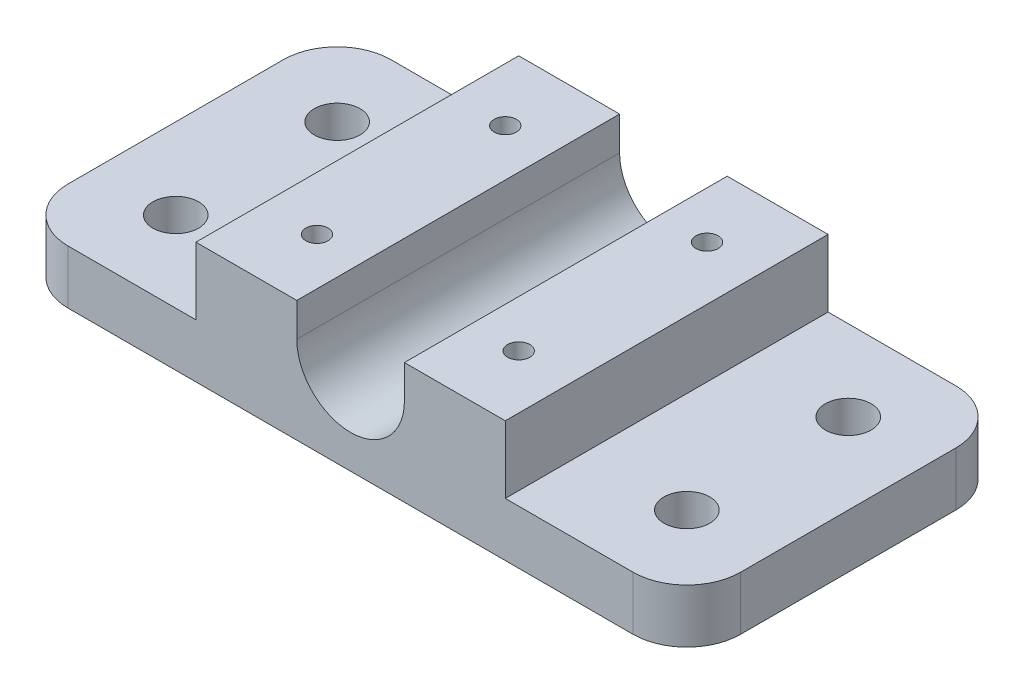
ISO-10303-21;
HEADER;
FILE_DESCRIPTION(('STEP AP214'),'2;1');
FILE_NAME('part.step','',(''),(''),'','','');
FILE_SCHEMA(('AUTOMOTIVE_DESIGN { 1 0 10303 214 1 1 1 1 }'));
ENDSEC;
DATA;
#1=APPLICATION_CONTEXT('core data for automotive mechanical design processes');
#2=APPLICATION_PROTOCOL_DEFINITION('international standard','automotive_design',2000,#1);
#3=PRODUCT_CONTEXT('',#1,'mechanical');
#4=PRODUCT('Part','Part','',(#3));
#5=PRODUCT_RELATED_PRODUCT_CATEGORY('part','',(#4));
#6=PRODUCT_DEFINITION_FORMATION('','',#4);
#7=PRODUCT_DEFINITION_CONTEXT('part definition',#1,'design');
#8=PRODUCT_DEFINITION('design','',#6,#7);
#9=PRODUCT_DEFINITION_SHAPE('','',#8);
#10=(LENGTH_UNIT() NAMED_UNIT(*) SI_UNIT(.MILLI.,.METRE.));
#11=(NAMED_UNIT(*) PLANE_ANGLE_UNIT() SI_UNIT($,.RADIAN.));
#12=(NAMED_UNIT(*) SI_UNIT($,.STERADIAN.) SOLID_ANGLE_UNIT());
#13=UNCERTAINTY_MEASURE_WITH_UNIT(LENGTH_MEASURE(1.E-05),#10,'distance_accuracy_value','');
#14=(GEOMETRIC_REPRESENTATION_CONTEXT(3) GLOBAL_UNCERTAINTY_ASSIGNED_CONTEXT((#13)) GLOBAL_UNIT_ASSIGNED_CONTEXT((#10,
#11,#12)) REPRESENTATION_CONTEXT('',''));
#15=CARTESIAN_POINT('',(0.,0.,0.));
#16=DIRECTION('',(0.,0.,1.));
#17=DIRECTION('',(1.,0.,0.));
#18=AXIS2_PLACEMENT_3D('',#15,#16,#17);
#19=CARTESIAN_POINT('',(0.,18.,0.));
#20=DIRECTION('',(0.,1.,0.));
#21=DIRECTION('',(0.,0.,1.));
#22=AXIS2_PLACEMENT_3D('',#19,#20,#21);
#23=PLANE('',#22);
#24=CARTESIAN_POINT('',(-15.,18.,-14.));
#25=DIRECTION('',(0.,1.,0.));
#26=DIRECTION('',(0.,0.,1.));
#27=AXIS2_PLACEMENT_3D('',#24,#25,#26);
#28=CIRCLE('',#27,1.64999999999999);
#29=CARTESIAN_POINT('',(-15.,18.,-12.35));
#30=VERTEX_POINT('',#29);
#31=EDGE_CURVE('E171',#30,#30,#28,.T.);
#32=ORIENTED_EDGE('',*,*,#31,.F.);
#33=EDGE_LOOP('',(#32));
#34=FACE_BOUND('',#33,.T.);
#35=CARTESIAN_POINT('',(-15.,18.,14.));
#36=DIRECTION('',(0.,1.,0.));
#37=DIRECTION('',(0.,0.,1.));
#38=AXIS2_PLACEMENT_3D('',#35,#36,#37);
#39=CIRCLE('',#38,1.64999999999999);
#40=CARTESIAN_POINT('',(-15.,18.,15.65));
#41=VERTEX_POINT('',#40);
#42=EDGE_CURVE('E170',#41,#41,#39,.T.);
#43=ORIENTED_EDGE('',*,*,#42,.F.);
#44=EDGE_LOOP('',(#43));
#45=FACE_BOUND('',#44,.T.);
#46=DIRECTION('',(0.,0.,1.));
#47=VECTOR('',#46,1.);
#48=CARTESIAN_POINT('',(-8.,18.,-24.));
#49=LINE('',#48,#47);
#50=CARTESIAN_POINT('',(-8.,18.,-24.));
#51=VERTEX_POINT('',#50);
#52=CARTESIAN_POINT('',(-8.,18.,24.));
#53=VERTEX_POINT('',#52);
#54=EDGE_CURVE('E216',#51,#53,#49,.T.);
#55=ORIENTED_EDGE('',*,*,#54,.F.);
#56=DIRECTION('',(-1.,0.,0.));
#57=VECTOR('',#56,1.);
#58=CARTESIAN_POINT('',(-23.,18.,-24.));
#59=LINE('',#58,#57);
#60=CARTESIAN_POINT('',(-23.,18.,-24.));
#61=VERTEX_POINT('',#60);
#62=EDGE_CURVE('E225',#51,#61,#59,.T.);
#63=ORIENTED_EDGE('',*,*,#62,.T.);
#64=DIRECTION('',(0.,0.,1.));
#65=VECTOR('',#64,1.);
#66=CARTESIAN_POINT('',(-23.,18.,-24.));
#67=LINE('',#66,#65);
#68=CARTESIAN_POINT('',(-23.,18.,24.));
#69=VERTEX_POINT('',#68);
#70=EDGE_CURVE('E230',#61,#69,#67,.T.);
#71=ORIENTED_EDGE('',*,*,#70,.T.);
#72=DIRECTION('',(1.,0.,0.));
#73=VECTOR('',#72,1.);
#74=CARTESIAN_POINT('',(-23.,18.,24.));
#75=LINE('',#74,#73);
#76=EDGE_CURVE('E233',#69,#53,#75,.T.);
#77=ORIENTED_EDGE('',*,*,#76,.T.);
#78=EDGE_LOOP('',(#55,#63,#71,#77));
#79=FACE_BOUND('',#78,.T.);
#80=ADVANCED_FACE('F37',(#34,#45,#79),#23,.T.);
#81=CARTESIAN_POINT('',(0.,8.,0.));
#82=DIRECTION('',(0.,1.,0.));
#83=DIRECTION('',(0.,0.,1.));
#84=AXIS2_PLACEMENT_3D('',#81,#82,#83);
#85=PLANE('',#84);
#86=CARTESIAN_POINT('',(38.,8.,12.));
#87=DIRECTION('',(0.,1.,0.));
#88=DIRECTION('',(0.,0.,1.));
#89=AXIS2_PLACEMENT_3D('',#86,#87,#88);
#90=CIRCLE('',#89,3.39999999999999);
#91=CARTESIAN_POINT('',(38.,8.,15.4));
#92=VERTEX_POINT('',#91);
#93=EDGE_CURVE('E455',#92,#92,#90,.T.);
#94=ORIENTED_EDGE('',*,*,#93,.F.);
#95=EDGE_LOOP('',(#94));
#96=FACE_BOUND('',#95,.T.);
#97=CARTESIAN_POINT('',(38.,8.,-12.));
#98=DIRECTION('',(0.,1.,0.));
#99=DIRECTION('',(0.,0.,1.));
#100=AXIS2_PLACEMENT_3D('',#97,#98,#99);
#101=CIRCLE('',#100,3.39999999999999);
#102=CARTESIAN_POINT('',(38.,8.,-8.60000000000001));
#103=VERTEX_POINT('',#102);
#104=EDGE_CURVE('E461',#103,#103,#101,.T.);
#105=ORIENTED_EDGE('',*,*,#104,.F.);
#106=EDGE_LOOP('',(#105));
#107=FACE_BOUND('',#106,.T.);
#108=DIRECTION('',(0.,0.,-1.));
#109=VECTOR('',#108,1.);
#110=CARTESIAN_POINT('',(50.,8.,-24.));
#111=LINE('',#110,#109);
#112=CARTESIAN_POINT('',(50.,8.,16.));
#113=VERTEX_POINT('',#112);
#114=CARTESIAN_POINT('',(50.,8.,-16.));
#115=VERTEX_POINT('',#114);
#116=EDGE_CURVE('E253',#113,#115,#111,.T.);
#117=ORIENTED_EDGE('',*,*,#116,.T.);
#118=CARTESIAN_POINT('',(42.,8.,-16.));
#119=DIRECTION('',(0.,1.,0.));
#120=DIRECTION('',(0.,0.,1.));
#121=AXIS2_PLACEMENT_3D('',#118,#119,#120);
#122=CIRCLE('',#121,8.);
#123=CARTESIAN_POINT('',(42.,8.,-24.));
#124=VERTEX_POINT('',#123);
#125=EDGE_CURVE('E294',#115,#124,#122,.T.);
#126=ORIENTED_EDGE('',*,*,#125,.T.);
#127=DIRECTION('',(-1.,0.,0.));
#128=VECTOR('',#127,1.);
#129=CARTESIAN_POINT('',(-50.,8.,-24.));
#130=LINE('',#129,#128);
#131=CARTESIAN_POINT('',(23.,8.,-24.));
#132=VERTEX_POINT('',#131);
#133=EDGE_CURVE('E258',#124,#132,#130,.T.);
#134=ORIENTED_EDGE('',*,*,#133,.T.);
#135=DIRECTION('',(0.,0.,-1.));
#136=VECTOR('',#135,1.);
#137=CARTESIAN_POINT('',(23.,8.,-24.));
#138=LINE('',#137,#136);
#139=CARTESIAN_POINT('',(23.,8.,24.));
#140=VERTEX_POINT('',#139);
#141=EDGE_CURVE('E215',#140,#132,#138,.T.);
#142=ORIENTED_EDGE('',*,*,#141,.F.);
#143=DIRECTION('',(1.,0.,0.));
#144=VECTOR('',#143,1.);
#145=CARTESIAN_POINT('',(-50.,8.,24.));
#146=LINE('',#145,#144);
#147=CARTESIAN_POINT('',(42.,8.,24.));
#148=VERTEX_POINT('',#147);
#149=EDGE_CURVE('E262',#140,#148,#146,.T.);
#150=ORIENTED_EDGE('',*,*,#149,.T.);
#151=CARTESIAN_POINT('',(42.,8.,16.));
#152=DIRECTION('',(0.,1.,0.));
#153=DIRECTION('',(0.,0.,1.));
#154=AXIS2_PLACEMENT_3D('',#151,#152,#153);
#155=CIRCLE('',#154,8.);
#156=EDGE_CURVE('E292',#148,#113,#155,.T.);
#157=ORIENTED_EDGE('',*,*,#156,.T.);
#158=EDGE_LOOP('',(#117,#126,#134,#142,#150,#157));
#159=FACE_BOUND('',#158,.T.);
#160=ADVANCED_FACE('F345',(#96,#107,#159),#85,.T.);
#161=CARTESIAN_POINT('',(50.,8.,-24.));
#162=DIRECTION('',(-1.,0.,0.));
#163=DIRECTION('',(0.,0.,1.));
#164=AXIS2_PLACEMENT_3D('',#161,#162,#163);
#165=PLANE('',#164);
#166=DIRECTION('',(0.,0.,-1.));
#167=VECTOR('',#166,1.);
#168=CARTESIAN_POINT('',(50.,0.,-24.));
#169=LINE('',#168,#167);
#170=CARTESIAN_POINT('',(50.,0.,16.));
#171=VERTEX_POINT('',#170);
#172=CARTESIAN_POINT('',(50.,0.,-16.));
#173=VERTEX_POINT('',#172);
#174=EDGE_CURVE('E252',#171,#173,#169,.T.);
#175=ORIENTED_EDGE('',*,*,#174,.T.);
#176=DIRECTION('',(0.,-1.,0.));
#177=VECTOR('',#176,1.);
#178=CARTESIAN_POINT('',(50.,8.,-16.));
#179=LINE('',#178,#177);
#180=EDGE_CURVE('E290',#173,#115,#179,.F.);
#181=ORIENTED_EDGE('',*,*,#180,.T.);
#182=ORIENTED_EDGE('',*,*,#116,.F.);
#183=DIRECTION('',(0.,-1.,0.));
#184=VECTOR('',#183,1.);
#185=CARTESIAN_POINT('',(50.,8.,16.));
#186=LINE('',#185,#184);
#187=EDGE_CURVE('E287',#113,#171,#186,.T.);
#188=ORIENTED_EDGE('',*,*,#187,.T.);
#189=EDGE_LOOP('',(#175,#181,#182,#188));
#190=FACE_BOUND('',#189,.T.);
#191=ADVANCED_FACE('F334',(#190),#165,.F.);
#192=CARTESIAN_POINT('',(-50.,8.,-24.));
#193=DIRECTION('',(0.,0.,1.));
#194=DIRECTION('',(1.,0.,0.));
#195=AXIS2_PLACEMENT_3D('',#192,#193,#194);
#196=PLANE('',#195);
#197=ORIENTED_EDGE('',*,*,#133,.F.);
#198=DIRECTION('',(0.,-1.,0.));
#199=VECTOR('',#198,1.);
#200=CARTESIAN_POINT('',(42.,8.,-24.));
#201=LINE('',#200,#199);
#202=CARTESIAN_POINT('',(42.,0.,-24.));
#203=VERTEX_POINT('',#202);
#204=EDGE_CURVE('E276',#124,#203,#201,.T.);
#205=ORIENTED_EDGE('',*,*,#204,.T.);
#206=DIRECTION('',(-1.,0.,0.));
#207=VECTOR('',#206,1.);
#208=CARTESIAN_POINT('',(-50.,0.,-24.));
#209=LINE('',#208,#207);
#210=CARTESIAN_POINT('',(-42.,0.,-24.));
#211=VERTEX_POINT('',#210);
#212=EDGE_CURVE('E268',#203,#211,#209,.T.);
#213=ORIENTED_EDGE('',*,*,#212,.T.);
#214=DIRECTION('',(0.,-1.,0.));
#215=VECTOR('',#214,1.);
#216=CARTESIAN_POINT('',(-42.,8.,-24.));
#217=LINE('',#216,#215);
#218=CARTESIAN_POINT('',(-42.,8.,-24.));
#219=VERTEX_POINT('',#218);
#220=EDGE_CURVE('E265',#211,#219,#217,.F.);
#221=ORIENTED_EDGE('',*,*,#220,.T.);
#222=CARTESIAN_POINT('',(-23.,8.,-24.));
#223=VERTEX_POINT('',#222);
#224=EDGE_CURVE('E256',#223,#219,#130,.T.);
#225=ORIENTED_EDGE('',*,*,#224,.F.);
#226=DIRECTION('',(0.,-1.,0.));
#227=VECTOR('',#226,1.);
#228=CARTESIAN_POINT('',(-23.,18.,-24.));
#229=LINE('',#228,#227);
#230=EDGE_CURVE('E246',#61,#223,#229,.T.);
#231=ORIENTED_EDGE('',*,*,#230,.F.);
#232=ORIENTED_EDGE('',*,*,#62,.F.);
#233=DIRECTION('',(0.,-1.,0.));
#234=VECTOR('',#233,1.);
#235=CARTESIAN_POINT('',(-8.,13.,-24.));
#236=LINE('',#235,#234);
#237=CARTESIAN_POINT('',(-8.,13.,-24.));
#238=VERTEX_POINT('',#237);
#239=EDGE_CURVE('E203',#51,#238,#236,.T.);
#240=ORIENTED_EDGE('',*,*,#239,.T.);
#241=CARTESIAN_POINT('',(0.,13.,-24.));
#242=DIRECTION('',(0.,0.,1.));
#243=DIRECTION('',(1.,0.,0.));
#244=AXIS2_PLACEMENT_3D('',#241,#242,#243);
#245=CIRCLE('',#244,8.);
#246=CARTESIAN_POINT('',(8.,13.,-24.));
#247=VERTEX_POINT('',#246);
#248=EDGE_CURVE('E196',#238,#247,#245,.T.);
#249=ORIENTED_EDGE('',*,*,#248,.T.);
#250=DIRECTION('',(0.,1.,0.));
#251=VECTOR('',#250,1.);
#252=CARTESIAN_POINT('',(8.,13.,-24.));
#253=LINE('',#252,#251);
#254=CARTESIAN_POINT('',(8.,18.,-24.));
#255=VERTEX_POINT('',#254);
#256=EDGE_CURVE('E199',#247,#255,#253,.T.);
#257=ORIENTED_EDGE('',*,*,#256,.T.);
#258=CARTESIAN_POINT('',(23.,18.,-24.));
#259=VERTEX_POINT('',#258);
#260=EDGE_CURVE('E227',#259,#255,#59,.T.);
#261=ORIENTED_EDGE('',*,*,#260,.F.);
#262=DIRECTION('',(0.,-1.,0.));
#263=VECTOR('',#262,1.);
#264=CARTESIAN_POINT('',(23.,18.,-24.));
#265=LINE('',#264,#263);
#266=EDGE_CURVE('E249',#259,#132,#265,.T.);
#267=ORIENTED_EDGE('',*,*,#266,.T.);
#268=EDGE_LOOP('',(#197,#205,#213,#221,#225,#231,#232,#240,#249,#257,#261,#267));
#269=FACE_BOUND('',#268,.T.);
#270=ADVANCED_FACE('F325',(#269),#196,.F.);
#271=CARTESIAN_POINT('',(-50.,8.,-24.));
#272=DIRECTION('',(1.,0.,0.));
#273=DIRECTION('',(0.,0.,-1.));
#274=AXIS2_PLACEMENT_3D('',#271,#272,#273);
#275=PLANE('',#274);
#276=DIRECTION('',(0.,0.,1.));
#277=VECTOR('',#276,1.);
#278=CARTESIAN_POINT('',(-50.,8.,-24.));
#279=LINE('',#278,#277);
#280=CARTESIAN_POINT('',(-50.,8.,-16.));
#281=VERTEX_POINT('',#280);
#282=CARTESIAN_POINT('',(-50.,8.,16.));
#283=VERTEX_POINT('',#282);
#284=EDGE_CURVE('E260',#281,#283,#279,.T.);
#285=ORIENTED_EDGE('',*,*,#284,.F.);
#286=DIRECTION('',(0.,-1.,0.));
#287=VECTOR('',#286,1.);
#288=CARTESIAN_POINT('',(-50.,8.,-16.));
#289=LINE('',#288,#287);
#290=CARTESIAN_POINT('',(-50.,0.,-16.));
#291=VERTEX_POINT('',#290);
#292=EDGE_CURVE('E302',#281,#291,#289,.T.);
#293=ORIENTED_EDGE('',*,*,#292,.T.);
#294=DIRECTION('',(0.,0.,1.));
#295=VECTOR('',#294,1.);
#296=CARTESIAN_POINT('',(-50.,0.,-24.));
#297=LINE('',#296,#295);
#298=CARTESIAN_POINT('',(-50.,0.,16.));
#299=VERTEX_POINT('',#298);
#300=EDGE_CURVE('E271',#291,#299,#297,.T.);
#301=ORIENTED_EDGE('',*,*,#300,.T.);
#302=DIRECTION('',(0.,-1.,0.));
#303=VECTOR('',#302,1.);
#304=CARTESIAN_POINT('',(-50.,8.,16.));
#305=LINE('',#304,#303);
#306=EDGE_CURVE('E52',#299,#283,#305,.F.);
#307=ORIENTED_EDGE('',*,*,#306,.T.);
#308=EDGE_LOOP('',(#285,#293,#301,#307));
#309=FACE_BOUND('',#308,.T.);
#310=ADVANCED_FACE('F318',(#309),#275,.F.);
#311=CARTESIAN_POINT('',(-50.,8.,24.));
#312=DIRECTION('',(0.,0.,-1.));
#313=DIRECTION('',(-1.,0.,0.));
#314=AXIS2_PLACEMENT_3D('',#311,#312,#313);
#315=PLANE('',#314);
#316=DIRECTION('',(1.,0.,0.));
#317=VECTOR('',#316,1.);
#318=CARTESIAN_POINT('',(-50.,0.,24.));
#319=LINE('',#318,#317);
#320=CARTESIAN_POINT('',(-42.,0.,24.));
#321=VERTEX_POINT('',#320);
#322=CARTESIAN_POINT('',(42.,0.,24.));
#323=VERTEX_POINT('',#322);
#324=EDGE_CURVE('E257',#321,#323,#319,.T.);
#325=ORIENTED_EDGE('',*,*,#324,.T.);
#326=DIRECTION('',(0.,-1.,0.));
#327=VECTOR('',#326,1.);
#328=CARTESIAN_POINT('',(42.,8.,24.));
#329=LINE('',#328,#327);
#330=EDGE_CURVE('E299',#323,#148,#329,.F.);
#331=ORIENTED_EDGE('',*,*,#330,.T.);
#332=ORIENTED_EDGE('',*,*,#149,.F.);
#333=DIRECTION('',(0.,-1.,0.));
#334=VECTOR('',#333,1.);
#335=CARTESIAN_POINT('',(23.,18.,24.));
#336=LINE('',#335,#334);
#337=CARTESIAN_POINT('',(23.,18.,24.));
#338=VERTEX_POINT('',#337);
#339=EDGE_CURVE('E236',#338,#140,#336,.T.);
#340=ORIENTED_EDGE('',*,*,#339,.F.);
#341=CARTESIAN_POINT('',(8.,18.,24.));
#342=VERTEX_POINT('',#341);
#343=EDGE_CURVE('E232',#342,#338,#75,.T.);
#344=ORIENTED_EDGE('',*,*,#343,.F.);
#345=DIRECTION('',(0.,1.,0.));
#346=VECTOR('',#345,1.);
#347=CARTESIAN_POINT('',(8.,13.,24.));
#348=LINE('',#347,#346);
#349=CARTESIAN_POINT('',(8.,13.,24.));
#350=VERTEX_POINT('',#349);
#351=EDGE_CURVE('E209',#350,#342,#348,.T.);
#352=ORIENTED_EDGE('',*,*,#351,.F.);
#353=CARTESIAN_POINT('',(0.,13.,24.));
#354=DIRECTION('',(0.,0.,1.));
#355=DIRECTION('',(1.,0.,0.));
#356=AXIS2_PLACEMENT_3D('',#353,#354,#355);
#357=CIRCLE('',#356,8.);
#358=CARTESIAN_POINT('',(-8.,13.,24.));
#359=VERTEX_POINT('',#358);
#360=EDGE_CURVE('E195',#359,#350,#357,.T.);
#361=ORIENTED_EDGE('',*,*,#360,.F.);
#362=DIRECTION('',(0.,-1.,0.));
#363=VECTOR('',#362,1.);
#364=CARTESIAN_POINT('',(-8.,13.,24.));
#365=LINE('',#364,#363);
#366=EDGE_CURVE('E200',#53,#359,#365,.T.);
#367=ORIENTED_EDGE('',*,*,#366,.F.);
#368=ORIENTED_EDGE('',*,*,#76,.F.);
#369=DIRECTION('',(0.,-1.,0.));
#370=VECTOR('',#369,1.);
#371=CARTESIAN_POINT('',(-23.,18.,24.));
#372=LINE('',#371,#370);
#373=CARTESIAN_POINT('',(-23.,8.,24.));
#374=VERTEX_POINT('',#373);
#375=EDGE_CURVE('E243',#69,#374,#372,.T.);
#376=ORIENTED_EDGE('',*,*,#375,.T.);
#377=CARTESIAN_POINT('',(-42.,8.,24.));
#378=VERTEX_POINT('',#377);
#379=EDGE_CURVE('E263',#378,#374,#146,.T.);
#380=ORIENTED_EDGE('',*,*,#379,.F.);
#381=DIRECTION('',(0.,-1.,0.));
#382=VECTOR('',#381,1.);
#383=CARTESIAN_POINT('',(-42.,8.,24.));
#384=LINE('',#383,#382);
#385=EDGE_CURVE('E296',#378,#321,#384,.T.);
#386=ORIENTED_EDGE('',*,*,#385,.T.);
#387=EDGE_LOOP('',(#325,#331,#332,#340,#344,#352,#361,#367,#368,#376,#380,#386));
#388=FACE_BOUND('',#387,.T.);
#389=ADVANCED_FACE('F310',(#388),#315,.F.);
#390=CARTESIAN_POINT('',(-38.,8.,-12.));
#391=DIRECTION('',(0.,1.,0.));
#392=DIRECTION('',(0.,0.,1.));
#393=AXIS2_PLACEMENT_3D('',#390,#391,#392);
#394=CIRCLE('',#393,3.39999999999999);
#395=CARTESIAN_POINT('',(-38.,8.,-8.60000000000001));
#396=VERTEX_POINT('',#395);
#397=EDGE_CURVE('E444',#396,#396,#394,.T.);
#398=ORIENTED_EDGE('',*,*,#397,.F.);
#399=EDGE_LOOP('',(#398));
#400=FACE_BOUND('',#399,.T.);
#401=CARTESIAN_POINT('',(-38.,8.,12.));
#402=DIRECTION('',(0.,1.,0.));
#403=DIRECTION('',(0.,0.,1.));
#404=AXIS2_PLACEMENT_3D('',#401,#402,#403);
#405=CIRCLE('',#404,3.39999999999999);
#406=CARTESIAN_POINT('',(-38.,8.,15.4));
#407=VERTEX_POINT('',#406);
#408=EDGE_CURVE('E447',#407,#407,#405,.T.);
#409=ORIENTED_EDGE('',*,*,#408,.F.);
#410=EDGE_LOOP('',(#409));
#411=FACE_BOUND('',#410,.T.);
#412=ORIENTED_EDGE('',*,*,#224,.T.);
#413=CARTESIAN_POINT('',(-42.,8.,-16.));
#414=DIRECTION('',(0.,1.,0.));
#415=DIRECTION('',(0.,0.,1.));
#416=AXIS2_PLACEMENT_3D('',#413,#414,#415);
#417=CIRCLE('',#416,8.);
#418=EDGE_CURVE('E11',#219,#281,#417,.T.);
#419=ORIENTED_EDGE('',*,*,#418,.T.);
#420=ORIENTED_EDGE('',*,*,#284,.T.);
#421=CARTESIAN_POINT('',(-42.,8.,16.));
#422=DIRECTION('',(0.,1.,0.));
#423=DIRECTION('',(0.,0.,1.));
#424=AXIS2_PLACEMENT_3D('',#421,#422,#423);
#425=CIRCLE('',#424,8.);
#426=EDGE_CURVE('E45',#283,#378,#425,.T.);
#427=ORIENTED_EDGE('',*,*,#426,.T.);
#428=ORIENTED_EDGE('',*,*,#379,.T.);
#429=DIRECTION('',(0.,0.,1.));
#430=VECTOR('',#429,1.);
#431=CARTESIAN_POINT('',(-23.,8.,-24.));
#432=LINE('',#431,#430);
#433=EDGE_CURVE('E226',#223,#374,#432,.T.);
#434=ORIENTED_EDGE('',*,*,#433,.F.);
#435=EDGE_LOOP('',(#412,#419,#420,#427,#428,#434));
#436=FACE_BOUND('',#435,.T.);
#437=ADVANCED_FACE('F306',(#400,#411,#436),#85,.T.);
#438=CARTESIAN_POINT('',(0.,0.,0.));
#439=DIRECTION('',(0.,1.,0.));
#440=DIRECTION('',(0.,0.,1.));
#441=AXIS2_PLACEMENT_3D('',#438,#439,#440);
#442=PLANE('',#441);
#443=CARTESIAN_POINT('',(-38.,0.,-12.));
#444=DIRECTION('',(0.,1.,0.));
#445=DIRECTION('',(0.,0.,1.));
#446=AXIS2_PLACEMENT_3D('',#443,#444,#445);
#447=CIRCLE('',#446,3.39999999999999);
#448=CARTESIAN_POINT('',(-38.,0.,-8.60000000000001));
#449=VERTEX_POINT('',#448);
#450=EDGE_CURVE('E441',#449,#449,#447,.T.);
#451=ORIENTED_EDGE('',*,*,#450,.T.);
#452=EDGE_LOOP('',(#451));
#453=FACE_BOUND('',#452,.T.);
#454=CARTESIAN_POINT('',(-38.,0.,12.));
#455=DIRECTION('',(0.,1.,0.));
#456=DIRECTION('',(0.,0.,1.));
#457=AXIS2_PLACEMENT_3D('',#454,#455,#456);
#458=CIRCLE('',#457,3.39999999999999);
#459=CARTESIAN_POINT('',(-38.,0.,15.4));
#460=VERTEX_POINT('',#459);
#461=EDGE_CURVE('E452',#460,#460,#458,.T.);
#462=ORIENTED_EDGE('',*,*,#461,.T.);
#463=EDGE_LOOP('',(#462));
#464=FACE_BOUND('',#463,.T.);
#465=CARTESIAN_POINT('',(38.,0.,12.));
#466=DIRECTION('',(0.,1.,0.));
#467=DIRECTION('',(0.,0.,1.));
#468=AXIS2_PLACEMENT_3D('',#465,#466,#467);
#469=CIRCLE('',#468,3.39999999999999);
#470=CARTESIAN_POINT('',(38.,0.,15.4));
#471=VERTEX_POINT('',#470);
#472=EDGE_CURVE('E458',#471,#471,#469,.T.);
#473=ORIENTED_EDGE('',*,*,#472,.T.);
#474=EDGE_LOOP('',(#473));
#475=FACE_BOUND('',#474,.T.);
#476=CARTESIAN_POINT('',(38.,0.,-12.));
#477=DIRECTION('',(0.,1.,0.));
#478=DIRECTION('',(0.,0.,1.));
#479=AXIS2_PLACEMENT_3D('',#476,#477,#478);
#480=CIRCLE('',#479,3.39999999999999);
#481=CARTESIAN_POINT('',(38.,0.,-8.60000000000001));
#482=VERTEX_POINT('',#481);
#483=EDGE_CURVE('E177',#482,#482,#480,.T.);
#484=ORIENTED_EDGE('',*,*,#483,.T.);
#485=EDGE_LOOP('',(#484));
#486=FACE_BOUND('',#485,.T.);
#487=ORIENTED_EDGE('',*,*,#212,.F.);
#488=CARTESIAN_POINT('',(42.,0.,-16.));
#489=DIRECTION('',(0.,1.,0.));
#490=DIRECTION('',(0.,0.,1.));
#491=AXIS2_PLACEMENT_3D('',#488,#489,#490);
#492=CIRCLE('',#491,8.);
#493=EDGE_CURVE('E285',#203,#173,#492,.F.);
#494=ORIENTED_EDGE('',*,*,#493,.T.);
#495=ORIENTED_EDGE('',*,*,#174,.F.);
#496=CARTESIAN_POINT('',(42.,0.,16.));
#497=DIRECTION('',(0.,1.,0.));
#498=DIRECTION('',(0.,0.,1.));
#499=AXIS2_PLACEMENT_3D('',#496,#497,#498);
#500=CIRCLE('',#499,8.);
#501=EDGE_CURVE('E283',#171,#323,#500,.F.);
#502=ORIENTED_EDGE('',*,*,#501,.T.);
#503=ORIENTED_EDGE('',*,*,#324,.F.);
#504=CARTESIAN_POINT('',(-42.,0.,16.));
#505=DIRECTION('',(0.,1.,0.));
#506=DIRECTION('',(0.,0.,1.));
#507=AXIS2_PLACEMENT_3D('',#504,#505,#506);
#508=CIRCLE('',#507,8.);
#509=EDGE_CURVE('E279',#321,#299,#508,.F.);
#510=ORIENTED_EDGE('',*,*,#509,.T.);
#511=ORIENTED_EDGE('',*,*,#300,.F.);
#512=CARTESIAN_POINT('',(-42.,0.,-16.));
#513=DIRECTION('',(0.,1.,0.));
#514=DIRECTION('',(0.,0.,1.));
#515=AXIS2_PLACEMENT_3D('',#512,#513,#514);
#516=CIRCLE('',#515,8.);
#517=EDGE_CURVE('E281',#291,#211,#516,.F.);
#518=ORIENTED_EDGE('',*,*,#517,.T.);
#519=EDGE_LOOP('',(#487,#494,#495,#502,#503,#510,#511,#518));
#520=FACE_BOUND('',#519,.T.);
#521=ADVANCED_FACE('F317',(#453,#464,#475,#486,#520),#442,.F.);
#522=CARTESIAN_POINT('',(23.,18.,-24.));
#523=DIRECTION('',(-1.,0.,0.));
#524=DIRECTION('',(0.,0.,1.));
#525=AXIS2_PLACEMENT_3D('',#522,#523,#524);
#526=PLANE('',#525);
#527=ORIENTED_EDGE('',*,*,#141,.T.);
#528=ORIENTED_EDGE('',*,*,#266,.F.);
#529=DIRECTION('',(0.,0.,-1.));
#530=VECTOR('',#529,1.);
#531=CARTESIAN_POINT('',(23.,18.,-24.));
#532=LINE('',#531,#530);
#533=EDGE_CURVE('E222',#338,#259,#532,.T.);
#534=ORIENTED_EDGE('',*,*,#533,.F.);
#535=ORIENTED_EDGE('',*,*,#339,.T.);
#536=EDGE_LOOP('',(#527,#528,#534,#535));
#537=FACE_BOUND('',#536,.T.);
#538=ADVANCED_FACE('F348',(#537),#526,.F.);
#539=CARTESIAN_POINT('',(-23.,18.,-24.));
#540=DIRECTION('',(1.,0.,0.));
#541=DIRECTION('',(0.,0.,-1.));
#542=AXIS2_PLACEMENT_3D('',#539,#540,#541);
#543=PLANE('',#542);
#544=ORIENTED_EDGE('',*,*,#433,.T.);
#545=ORIENTED_EDGE('',*,*,#375,.F.);
#546=ORIENTED_EDGE('',*,*,#70,.F.);
#547=ORIENTED_EDGE('',*,*,#230,.T.);
#548=EDGE_LOOP('',(#544,#545,#546,#547));
#549=FACE_BOUND('',#548,.T.);
#550=ADVANCED_FACE('F369',(#549),#543,.F.);
#551=CARTESIAN_POINT('',(15.,18.,14.));
#552=DIRECTION('',(0.,1.,0.));
#553=DIRECTION('',(0.,0.,1.));
#554=AXIS2_PLACEMENT_3D('',#551,#552,#553);
#555=CIRCLE('',#554,1.64999999999999);
#556=CARTESIAN_POINT('',(15.,18.,15.65));
#557=VERTEX_POINT('',#556);
#558=EDGE_CURVE('E183',#557,#557,#555,.T.);
#559=ORIENTED_EDGE('',*,*,#558,.F.);
#560=EDGE_LOOP('',(#559));
#561=FACE_BOUND('',#560,.T.);
#562=CARTESIAN_POINT('',(15.,18.,-14.));
#563=DIRECTION('',(0.,1.,0.));
#564=DIRECTION('',(0.,0.,1.));
#565=AXIS2_PLACEMENT_3D('',#562,#563,#564);
#566=CIRCLE('',#565,1.64999999999999);
#567=CARTESIAN_POINT('',(15.,18.,-12.35));
#568=VERTEX_POINT('',#567);
#569=EDGE_CURVE('E189',#568,#568,#566,.T.);
#570=ORIENTED_EDGE('',*,*,#569,.F.);
#571=EDGE_LOOP('',(#570));
#572=FACE_BOUND('',#571,.T.);
#573=DIRECTION('',(0.,0.,1.));
#574=VECTOR('',#573,1.);
#575=CARTESIAN_POINT('',(8.,18.,-24.));
#576=LINE('',#575,#574);
#577=EDGE_CURVE('E218',#255,#342,#576,.T.);
#578=ORIENTED_EDGE('',*,*,#577,.T.);
#579=ORIENTED_EDGE('',*,*,#343,.T.);
#580=ORIENTED_EDGE('',*,*,#533,.T.);
#581=ORIENTED_EDGE('',*,*,#260,.T.);
#582=EDGE_LOOP('',(#578,#579,#580,#581));
#583=FACE_BOUND('',#582,.T.);
#584=ADVANCED_FACE('F354',(#561,#572,#583),#23,.T.);
#585=CARTESIAN_POINT('',(0.,13.,-24.));
#586=DIRECTION('',(0.,0.,1.));
#587=DIRECTION('',(1.,0.,0.));
#588=AXIS2_PLACEMENT_3D('',#585,#586,#587);
#589=CYLINDRICAL_SURFACE('',#588,8.);
#590=ORIENTED_EDGE('',*,*,#360,.T.);
#591=DIRECTION('',(0.,0.,1.));
#592=VECTOR('',#591,1.);
#593=CARTESIAN_POINT('',(8.,13.,-24.));
#594=LINE('',#593,#592);
#595=EDGE_CURVE('E206',#247,#350,#594,.T.);
#596=ORIENTED_EDGE('',*,*,#595,.F.);
#597=ORIENTED_EDGE('',*,*,#248,.F.);
#598=DIRECTION('',(0.,0.,1.));
#599=VECTOR('',#598,1.);
#600=CARTESIAN_POINT('',(-8.,13.,-24.));
#601=LINE('',#600,#599);
#602=EDGE_CURVE('E213',#238,#359,#601,.T.);
#603=ORIENTED_EDGE('',*,*,#602,.T.);
#604=EDGE_LOOP('',(#590,#596,#597,#603));
#605=FACE_BOUND('',#604,.T.);
#606=ADVANCED_FACE('F361',(#605),#589,.F.);
#607=CARTESIAN_POINT('',(-8.,13.,-24.));
#608=DIRECTION('',(-1.,0.,0.));
#609=DIRECTION('',(0.,-1.,0.));
#610=AXIS2_PLACEMENT_3D('',#607,#608,#609);
#611=PLANE('',#610);
#612=ORIENTED_EDGE('',*,*,#366,.T.);
#613=ORIENTED_EDGE('',*,*,#602,.F.);
#614=ORIENTED_EDGE('',*,*,#239,.F.);
#615=ORIENTED_EDGE('',*,*,#54,.T.);
#616=EDGE_LOOP('',(#612,#613,#614,#615));
#617=FACE_BOUND('',#616,.T.);
#618=ADVANCED_FACE('F391',(#617),#611,.F.);
#619=CARTESIAN_POINT('',(8.,13.,-24.));
#620=DIRECTION('',(1.,0.,0.));
#621=DIRECTION('',(0.,1.,0.));
#622=AXIS2_PLACEMENT_3D('',#619,#620,#621);
#623=PLANE('',#622);
#624=ORIENTED_EDGE('',*,*,#351,.T.);
#625=ORIENTED_EDGE('',*,*,#577,.F.);
#626=ORIENTED_EDGE('',*,*,#256,.F.);
#627=ORIENTED_EDGE('',*,*,#595,.T.);
#628=EDGE_LOOP('',(#624,#625,#626,#627));
#629=FACE_BOUND('',#628,.T.);
#630=ADVANCED_FACE('F357',(#629),#623,.F.);
#631=CARTESIAN_POINT('',(42.,8.,-16.));
#632=DIRECTION('',(0.,-1.,0.));
#633=DIRECTION('',(0.,0.,-1.));
#634=AXIS2_PLACEMENT_3D('',#631,#632,#633);
#635=CYLINDRICAL_SURFACE('',#634,8.);
#636=ORIENTED_EDGE('',*,*,#125,.F.);
#637=ORIENTED_EDGE('',*,*,#180,.F.);
#638=ORIENTED_EDGE('',*,*,#493,.F.);
#639=ORIENTED_EDGE('',*,*,#204,.F.);
#640=EDGE_LOOP('',(#636,#637,#638,#639));
#641=FACE_BOUND('',#640,.T.);
#642=ADVANCED_FACE('F330',(#641),#635,.T.);
#643=CARTESIAN_POINT('',(42.,8.,16.));
#644=DIRECTION('',(0.,-1.,0.));
#645=DIRECTION('',(0.,0.,-1.));
#646=AXIS2_PLACEMENT_3D('',#643,#644,#645);
#647=CYLINDRICAL_SURFACE('',#646,8.);
#648=ORIENTED_EDGE('',*,*,#156,.F.);
#649=ORIENTED_EDGE('',*,*,#330,.F.);
#650=ORIENTED_EDGE('',*,*,#501,.F.);
#651=ORIENTED_EDGE('',*,*,#187,.F.);
#652=EDGE_LOOP('',(#648,#649,#650,#651));
#653=FACE_BOUND('',#652,.T.);
#654=ADVANCED_FACE('F339',(#653),#647,.T.);
#655=CARTESIAN_POINT('',(-42.,8.,-16.));
#656=DIRECTION('',(0.,-1.,0.));
#657=DIRECTION('',(0.,0.,-1.));
#658=AXIS2_PLACEMENT_3D('',#655,#656,#657);
#659=CYLINDRICAL_SURFACE('',#658,8.);
#660=ORIENTED_EDGE('',*,*,#418,.F.);
#661=ORIENTED_EDGE('',*,*,#220,.F.);
#662=ORIENTED_EDGE('',*,*,#517,.F.);
#663=ORIENTED_EDGE('',*,*,#292,.F.);
#664=EDGE_LOOP('',(#660,#661,#662,#663));
#665=FACE_BOUND('',#664,.T.);
#666=ADVANCED_FACE('F321',(#665),#659,.T.);
#667=CARTESIAN_POINT('',(-42.,8.,16.));
#668=DIRECTION('',(0.,-1.,0.));
#669=DIRECTION('',(0.,0.,-1.));
#670=AXIS2_PLACEMENT_3D('',#667,#668,#669);
#671=CYLINDRICAL_SURFACE('',#670,8.);
#672=ORIENTED_EDGE('',*,*,#426,.F.);
#673=ORIENTED_EDGE('',*,*,#306,.F.);
#674=ORIENTED_EDGE('',*,*,#509,.F.);
#675=ORIENTED_EDGE('',*,*,#385,.F.);
#676=EDGE_LOOP('',(#672,#673,#674,#675));
#677=FACE_BOUND('',#676,.T.);
#678=ADVANCED_FACE('F39',(#677),#671,.T.);
#679=CARTESIAN_POINT('',(15.,8.00000000000001,-14.));
#680=DIRECTION('',(0.,1.,0.));
#681=DIRECTION('',(0.,0.,1.));
#682=AXIS2_PLACEMENT_3D('',#679,#680,#681);
#683=CONICAL_SURFACE('',#682,1.64999999999999,1.02974425867665);
#684=CARTESIAN_POINT('',(15.,7.00857997860453,-14.));
#685=VERTEX_POINT('',#684);
#686=VERTEX_LOOP('',#685);
#687=FACE_BOUND('',#686,.T.);
#688=CARTESIAN_POINT('',(15.,8.00000000000001,-14.));
#689=DIRECTION('',(0.,1.,0.));
#690=DIRECTION('',(0.,0.,1.));
#691=AXIS2_PLACEMENT_3D('',#688,#689,#690);
#692=CIRCLE('',#691,1.64999999999999);
#693=CARTESIAN_POINT('',(15.,8.00000000000001,-12.35));
#694=VERTEX_POINT('',#693);
#695=EDGE_CURVE('E192',#694,#694,#692,.T.);
#696=ORIENTED_EDGE('',*,*,#695,.T.);
#697=EDGE_LOOP('',(#696));
#698=FACE_BOUND('',#697,.T.);
#699=ADVANCED_FACE('F396',(#687,#698),#683,.F.);
#700=CARTESIAN_POINT('',(15.,18.,-14.));
#701=DIRECTION('',(0.,1.,0.));
#702=DIRECTION('',(0.,0.,1.));
#703=AXIS2_PLACEMENT_3D('',#700,#701,#702);
#704=CYLINDRICAL_SURFACE('',#703,1.64999999999999);
#705=ORIENTED_EDGE('',*,*,#695,.F.);
#706=EDGE_LOOP('',(#705));
#707=FACE_BOUND('',#706,.T.);
#708=ORIENTED_EDGE('',*,*,#569,.T.);
#709=EDGE_LOOP('',(#708));
#710=FACE_BOUND('',#709,.T.);
#711=ADVANCED_FACE('F399',(#707,#710),#704,.F.);
#712=CARTESIAN_POINT('',(15.,8.00000000000001,14.));
#713=DIRECTION('',(0.,1.,0.));
#714=DIRECTION('',(0.,0.,1.));
#715=AXIS2_PLACEMENT_3D('',#712,#713,#714);
#716=CONICAL_SURFACE('',#715,1.64999999999999,1.02974425867665);
#717=CARTESIAN_POINT('',(15.,7.00857997860453,14.));
#718=VERTEX_POINT('',#717);
#719=VERTEX_LOOP('',#718);
#720=FACE_BOUND('',#719,.T.);
#721=CARTESIAN_POINT('',(15.,8.00000000000001,14.));
#722=DIRECTION('',(0.,1.,0.));
#723=DIRECTION('',(0.,0.,1.));
#724=AXIS2_PLACEMENT_3D('',#721,#722,#723);
#725=CIRCLE('',#724,1.64999999999999);
#726=CARTESIAN_POINT('',(15.,8.00000000000001,15.65));
#727=VERTEX_POINT('',#726);
#728=EDGE_CURVE('E186',#727,#727,#725,.T.);
#729=ORIENTED_EDGE('',*,*,#728,.T.);
#730=EDGE_LOOP('',(#729));
#731=FACE_BOUND('',#730,.T.);
#732=ADVANCED_FACE('F403',(#720,#731),#716,.F.);
#733=CARTESIAN_POINT('',(15.,18.,14.));
#734=DIRECTION('',(0.,1.,0.));
#735=DIRECTION('',(0.,0.,1.));
#736=AXIS2_PLACEMENT_3D('',#733,#734,#735);
#737=CYLINDRICAL_SURFACE('',#736,1.64999999999999);
#738=ORIENTED_EDGE('',*,*,#728,.F.);
#739=EDGE_LOOP('',(#738));
#740=FACE_BOUND('',#739,.T.);
#741=ORIENTED_EDGE('',*,*,#558,.T.);
#742=EDGE_LOOP('',(#741));
#743=FACE_BOUND('',#742,.T.);
#744=ADVANCED_FACE('F407',(#740,#743),#737,.F.);
#745=CARTESIAN_POINT('',(-15.,8.00000000000001,14.));
#746=DIRECTION('',(0.,1.,0.));
#747=DIRECTION('',(0.,0.,1.));
#748=AXIS2_PLACEMENT_3D('',#745,#746,#747);
#749=CONICAL_SURFACE('',#748,1.64999999999999,1.02974425867665);
#750=CARTESIAN_POINT('',(-15.,7.00857997860453,14.));
#751=VERTEX_POINT('',#750);
#752=VERTEX_LOOP('',#751);
#753=FACE_BOUND('',#752,.T.);
#754=CARTESIAN_POINT('',(-15.,8.00000000000001,14.));
#755=DIRECTION('',(0.,1.,0.));
#756=DIRECTION('',(0.,0.,1.));
#757=AXIS2_PLACEMENT_3D('',#754,#755,#756);
#758=CIRCLE('',#757,1.64999999999999);
#759=CARTESIAN_POINT('',(-15.,8.00000000000001,15.65));
#760=VERTEX_POINT('',#759);
#761=EDGE_CURVE('E174',#760,#760,#758,.T.);
#762=ORIENTED_EDGE('',*,*,#761,.T.);
#763=EDGE_LOOP('',(#762));
#764=FACE_BOUND('',#763,.T.);
#765=ADVANCED_FACE('F411',(#753,#764),#749,.F.);
#766=CARTESIAN_POINT('',(-15.,18.,14.));
#767=DIRECTION('',(0.,1.,0.));
#768=DIRECTION('',(0.,0.,1.));
#769=AXIS2_PLACEMENT_3D('',#766,#767,#768);
#770=CYLINDRICAL_SURFACE('',#769,1.64999999999999);
#771=ORIENTED_EDGE('',*,*,#761,.F.);
#772=EDGE_LOOP('',(#771));
#773=FACE_BOUND('',#772,.T.);
#774=ORIENTED_EDGE('',*,*,#42,.T.);
#775=EDGE_LOOP('',(#774));
#776=FACE_BOUND('',#775,.T.);
#777=ADVANCED_FACE('F164',(#773,#776),#770,.F.);
#778=CARTESIAN_POINT('',(-15.,8.00000000000001,-14.));
#779=DIRECTION('',(0.,1.,0.));
#780=DIRECTION('',(0.,0.,1.));
#781=AXIS2_PLACEMENT_3D('',#778,#779,#780);
#782=CONICAL_SURFACE('',#781,1.64999999999999,1.02974425867665);
#783=CARTESIAN_POINT('',(-15.,7.00857997860453,-14.));
#784=VERTEX_POINT('',#783);
#785=VERTEX_LOOP('',#784);
#786=FACE_BOUND('',#785,.T.);
#787=CARTESIAN_POINT('',(-15.,8.00000000000001,-14.));
#788=DIRECTION('',(0.,1.,0.));
#789=DIRECTION('',(0.,0.,1.));
#790=AXIS2_PLACEMENT_3D('',#787,#788,#789);
#791=CIRCLE('',#790,1.64999999999999);
#792=CARTESIAN_POINT('',(-15.,8.00000000000001,-12.35));
#793=VERTEX_POINT('',#792);
#794=EDGE_CURVE('E168',#793,#793,#791,.T.);
#795=ORIENTED_EDGE('',*,*,#794,.T.);
#796=EDGE_LOOP('',(#795));
#797=FACE_BOUND('',#796,.T.);
#798=ADVANCED_FACE('F160',(#786,#797),#782,.F.);
#799=CARTESIAN_POINT('',(-15.,18.,-14.));
#800=DIRECTION('',(0.,1.,0.));
#801=DIRECTION('',(0.,0.,1.));
#802=AXIS2_PLACEMENT_3D('',#799,#800,#801);
#803=CYLINDRICAL_SURFACE('',#802,1.64999999999999);
#804=ORIENTED_EDGE('',*,*,#794,.F.);
#805=EDGE_LOOP('',(#804));
#806=FACE_BOUND('',#805,.T.);
#807=ORIENTED_EDGE('',*,*,#31,.T.);
#808=EDGE_LOOP('',(#807));
#809=FACE_BOUND('',#808,.T.);
#810=ADVANCED_FACE('F163',(#806,#809),#803,.F.);
#811=CARTESIAN_POINT('',(38.,8.,-12.));
#812=DIRECTION('',(0.,1.,0.));
#813=DIRECTION('',(0.,0.,1.));
#814=AXIS2_PLACEMENT_3D('',#811,#812,#813);
#815=CYLINDRICAL_SURFACE('',#814,3.39999999999999);
#816=ORIENTED_EDGE('',*,*,#483,.F.);
#817=EDGE_LOOP('',(#816));
#818=FACE_BOUND('',#817,.T.);
#819=ORIENTED_EDGE('',*,*,#104,.T.);
#820=EDGE_LOOP('',(#819));
#821=FACE_BOUND('',#820,.T.);
#822=ADVANCED_FACE('F421',(#818,#821),#815,.F.);
#823=CARTESIAN_POINT('',(38.,8.,12.));
#824=DIRECTION('',(0.,1.,0.));
#825=DIRECTION('',(0.,0.,1.));
#826=AXIS2_PLACEMENT_3D('',#823,#824,#825);
#827=CYLINDRICAL_SURFACE('',#826,3.39999999999999);
#828=ORIENTED_EDGE('',*,*,#472,.F.);
#829=EDGE_LOOP('',(#828));
#830=FACE_BOUND('',#829,.T.);
#831=ORIENTED_EDGE('',*,*,#93,.T.);
#832=EDGE_LOOP('',(#831));
#833=FACE_BOUND('',#832,.T.);
#834=ADVANCED_FACE('F424',(#830,#833),#827,.F.);
#835=CARTESIAN_POINT('',(-38.,8.,12.));
#836=DIRECTION('',(0.,1.,0.));
#837=DIRECTION('',(0.,0.,1.));
#838=AXIS2_PLACEMENT_3D('',#835,#836,#837);
#839=CYLINDRICAL_SURFACE('',#838,3.39999999999999);
#840=ORIENTED_EDGE('',*,*,#461,.F.);
#841=EDGE_LOOP('',(#840));
#842=FACE_BOUND('',#841,.T.);
#843=ORIENTED_EDGE('',*,*,#408,.T.);
#844=EDGE_LOOP('',(#843));
#845=FACE_BOUND('',#844,.T.);
#846=ADVANCED_FACE('F428',(#842,#845),#839,.F.);
#847=CARTESIAN_POINT('',(-38.,8.,-12.));
#848=DIRECTION('',(0.,1.,0.));
#849=DIRECTION('',(0.,0.,1.));
#850=AXIS2_PLACEMENT_3D('',#847,#848,#849);
#851=CYLINDRICAL_SURFACE('',#850,3.39999999999999);
#852=ORIENTED_EDGE('',*,*,#450,.F.);
#853=EDGE_LOOP('',(#852));
#854=FACE_BOUND('',#853,.T.);
#855=ORIENTED_EDGE('',*,*,#397,.T.);
#856=EDGE_LOOP('',(#855));
#857=FACE_BOUND('',#856,.T.);
#858=ADVANCED_FACE('F432',(#854,#857),#851,.F.);
#859=CLOSED_SHELL('',(#80,#160,#191,#270,#310,#389,#437,#521,#538,#550,#584,#606,#618,#630,#642,
#654,#666,#678,#699,#711,#732,#744,#765,#777,#798,#810,#822,#834,#846,#858));
#860=MANIFOLD_SOLID_BREP('B2',#859);
#861=ADVANCED_BREP_SHAPE_REPRESENTATION('',(#18,#860),#14);
#862=SHAPE_DEFINITION_REPRESENTATION(#9,#861);
ENDSEC;
END-ISO-10303-21;
